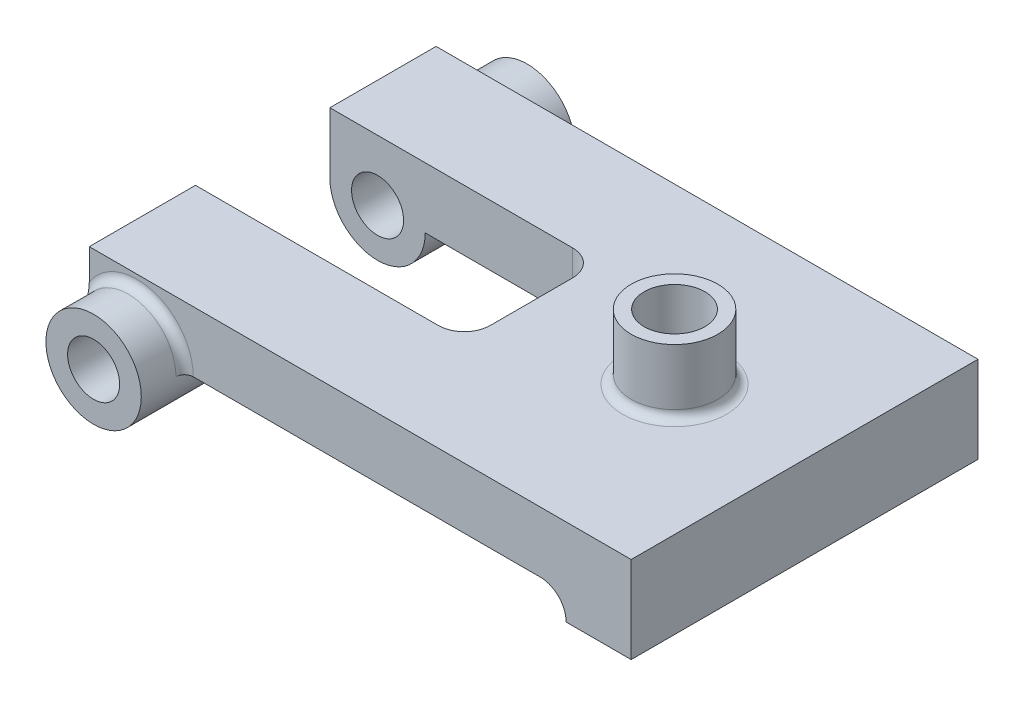
ISO-10303-21;
HEADER;
FILE_DESCRIPTION(('STEP AP214'),'2;1');
FILE_NAME('part.step','',(''),(''),'','','');
FILE_SCHEMA(('AUTOMOTIVE_DESIGN { 1 0 10303 214 1 1 1 1 }'));
ENDSEC;
DATA;
#1=APPLICATION_CONTEXT('core data for automotive mechanical design processes');
#2=APPLICATION_PROTOCOL_DEFINITION('international standard','automotive_design',2000,#1);
#3=PRODUCT_CONTEXT('',#1,'mechanical');
#4=PRODUCT('Part','Part','',(#3));
#5=PRODUCT_RELATED_PRODUCT_CATEGORY('part','',(#4));
#6=PRODUCT_DEFINITION_FORMATION('','',#4);
#7=PRODUCT_DEFINITION_CONTEXT('part definition',#1,'design');
#8=PRODUCT_DEFINITION('design','',#6,#7);
#9=PRODUCT_DEFINITION_SHAPE('','',#8);
#10=(LENGTH_UNIT() NAMED_UNIT(*) SI_UNIT(.MILLI.,.METRE.));
#11=(NAMED_UNIT(*) PLANE_ANGLE_UNIT() SI_UNIT($,.RADIAN.));
#12=(NAMED_UNIT(*) SI_UNIT($,.STERADIAN.) SOLID_ANGLE_UNIT());
#13=UNCERTAINTY_MEASURE_WITH_UNIT(LENGTH_MEASURE(1.E-05),#10,'distance_accuracy_value','');
#14=(GEOMETRIC_REPRESENTATION_CONTEXT(3) GLOBAL_UNCERTAINTY_ASSIGNED_CONTEXT((#13)) GLOBAL_UNIT_ASSIGNED_CONTEXT((#10,
#11,#12)) REPRESENTATION_CONTEXT('',''));
#15=CARTESIAN_POINT('',(0.,0.,0.));
#16=DIRECTION('',(0.,0.,1.));
#17=DIRECTION('',(1.,0.,0.));
#18=AXIS2_PLACEMENT_3D('',#15,#16,#17);
#19=CARTESIAN_POINT('',(0.,0.,40.));
#20=DIRECTION('',(-1.,0.,0.));
#21=DIRECTION('',(0.,-1.,0.));
#22=AXIS2_PLACEMENT_3D('',#19,#20,#21);
#23=PLANE('',#22);
#24=DIRECTION('',(0.,-1.,0.));
#25=VECTOR('',#24,1.);
#26=CARTESIAN_POINT('',(0.,20.,-15.5));
#27=LINE('',#26,#25);
#28=CARTESIAN_POINT('',(0.,20.,-15.5));
#29=VERTEX_POINT('',#28);
#30=CARTESIAN_POINT('',(0.,5.99631601618133,-15.5));
#31=VERTEX_POINT('',#30);
#32=EDGE_CURVE('E177',#29,#31,#27,.T.);
#33=ORIENTED_EDGE('',*,*,#32,.F.);
#34=DIRECTION('',(0.,0.,-1.));
#35=VECTOR('',#34,1.);
#36=CARTESIAN_POINT('',(0.,20.,40.));
#37=LINE('',#36,#35);
#38=CARTESIAN_POINT('',(0.,20.,-40.));
#39=VERTEX_POINT('',#38);
#40=EDGE_CURVE('E185',#29,#39,#37,.T.);
#41=ORIENTED_EDGE('',*,*,#40,.T.);
#42=DIRECTION('',(0.,1.,0.));
#43=VECTOR('',#42,1.);
#44=CARTESIAN_POINT('',(0.,0.,-40.));
#45=LINE('',#44,#43);
#46=CARTESIAN_POINT('',(0.,12.9245192464568,-40.));
#47=VERTEX_POINT('',#46);
#48=EDGE_CURVE('E292',#47,#39,#45,.T.);
#49=ORIENTED_EDGE('',*,*,#48,.F.);
#50=CARTESIAN_POINT('',(0.,12.9245192464568,-40.));
#51=CARTESIAN_POINT('',(0.,12.7926347995667,-40.0000195877206));
#52=CARTESIAN_POINT('',(0.,12.6607933304358,-40.0037039568171));
#53=CARTESIAN_POINT('',(0.,12.3975293760266,-40.0176384033789));
#54=CARTESIAN_POINT('',(0.,12.2661066899312,-40.0278846179913));
#55=CARTESIAN_POINT('',(0.,12.0042236462331,-40.0541440086299));
#56=CARTESIAN_POINT('',(0.,11.8737616263682,-40.0701410055855));
#57=CARTESIAN_POINT('',(0.,11.6135595427475,-40.1072767015453));
#58=CARTESIAN_POINT('',(0.,11.4838195999379,-40.1284162368858));
#59=CARTESIAN_POINT('',(0.,11.0985397145106,-40.1981930126899));
#60=CARTESIAN_POINT('',(0.,10.844195922614,-40.2534888297203));
#61=CARTESIAN_POINT('',(0.,10.3388851084676,-40.3782545428354));
#62=CARTESIAN_POINT('',(0.,10.0879210267826,-40.4477360266855));
#63=CARTESIAN_POINT('',(0.,9.51210822230671,-40.6210301613931));
#64=CARTESIAN_POINT('',(0.,9.18846281205875,-40.7288093836495));
#65=CARTESIAN_POINT('',(0.,8.54588775016297,-40.9576910405927));
#66=CARTESIAN_POINT('',(0.,8.22695977251006,-41.0787980818546));
#67=CARTESIAN_POINT('',(0.,7.27375991743096,-41.4553689198549));
#68=CARTESIAN_POINT('',(0.,6.64460404261237,-41.7235697880645));
#69=CARTESIAN_POINT('',(0.,6.00917952405726,-41.9945149951131));
#70=CARTESIAN_POINT('',(0.,6.00274776514438,-41.9972575065247));
#71=CARTESIAN_POINT('',(0.,5.99631601618133,-42.));
#72=B_SPLINE_CURVE_WITH_KNOTS('',3,(#50,#51,#52,#53,#54,#55,#56,#57,#58,#59,#60,#61,#62,#63,#64,
#65,#66,#67,#68,#69,#70,#71),.UNSPECIFIED.,.F.,.F.,(4,2,2,2,2,2,2,2,2,2,4),(0.,
0.395540642762623,0.790848650888231,1.18505310551169,1.57932171293576,2.35959856433424,
3.14051536472971,4.1634198417919,5.18667898860569,7.23803512077282,7.25901129773622),.UNSPECIFIED.);
#73=CARTESIAN_POINT('',(0.,5.99631601618133,-42.));
#74=VERTEX_POINT('',#73);
#75=EDGE_CURVE('E222',#47,#74,#72,.T.);
#76=ORIENTED_EDGE('',*,*,#75,.T.);
#77=DIRECTION('',(0.,0.,-1.));
#78=VECTOR('',#77,1.);
#79=CARTESIAN_POINT('',(0.,5.99631601618133,40.));
#80=LINE('',#79,#78);
#81=EDGE_CURVE('E285',#31,#74,#80,.T.);
#82=ORIENTED_EDGE('',*,*,#81,.F.);
#83=EDGE_LOOP('',(#33,#41,#49,#76,#82));
#84=FACE_BOUND('',#83,.T.);
#85=ADVANCED_FACE('F41',(#84),#23,.T.);
#86=CARTESIAN_POINT('',(0.,20.,40.));
#87=DIRECTION('',(0.,1.,0.));
#88=DIRECTION('',(0.,0.,1.));
#89=AXIS2_PLACEMENT_3D('',#86,#87,#88);
#90=PLANE('',#89);
#91=CARTESIAN_POINT('',(94.9999999999999,20.,0.));
#92=DIRECTION('',(0.,1.,0.));
#93=DIRECTION('',(0.,0.,1.));
#94=AXIS2_PLACEMENT_3D('',#91,#92,#93);
#95=CIRCLE('',#94,12.);
#96=CARTESIAN_POINT('',(94.9999999999999,20.,12.));
#97=VERTEX_POINT('',#96);
#98=EDGE_CURVE('E210',#97,#97,#95,.F.);
#99=ORIENTED_EDGE('',*,*,#98,.T.);
#100=EDGE_LOOP('',(#99));
#101=FACE_BOUND('',#100,.T.);
#102=DIRECTION('',(0.,0.,-1.));
#103=VECTOR('',#102,1.);
#104=CARTESIAN_POINT('',(62.,20.,-15.5));
#105=LINE('',#104,#103);
#106=CARTESIAN_POINT('',(62.,20.,9.5));
#107=VERTEX_POINT('',#106);
#108=CARTESIAN_POINT('',(62.,20.,-9.5));
#109=VERTEX_POINT('',#108);
#110=EDGE_CURVE('E167',#107,#109,#105,.T.);
#111=ORIENTED_EDGE('',*,*,#110,.F.);
#112=CARTESIAN_POINT('',(56.,20.,9.5));
#113=DIRECTION('',(0.,1.,0.));
#114=DIRECTION('',(0.,0.,1.));
#115=AXIS2_PLACEMENT_3D('',#112,#113,#114);
#116=CIRCLE('',#115,6.);
#117=CARTESIAN_POINT('',(56.,20.,15.5));
#118=VERTEX_POINT('',#117);
#119=EDGE_CURVE('E165',#107,#118,#116,.F.);
#120=ORIENTED_EDGE('',*,*,#119,.T.);
#121=DIRECTION('',(-1.,0.,0.));
#122=VECTOR('',#121,1.);
#123=CARTESIAN_POINT('',(62.,20.,15.5));
#124=LINE('',#123,#122);
#125=CARTESIAN_POINT('',(0.,20.,15.5));
#126=VERTEX_POINT('',#125);
#127=EDGE_CURVE('E152',#118,#126,#124,.T.);
#128=ORIENTED_EDGE('',*,*,#127,.T.);
#129=CARTESIAN_POINT('',(0.,20.,40.));
#130=VERTEX_POINT('',#129);
#131=EDGE_CURVE('E159',#130,#126,#37,.T.);
#132=ORIENTED_EDGE('',*,*,#131,.F.);
#133=DIRECTION('',(1.,0.,0.));
#134=VECTOR('',#133,1.);
#135=CARTESIAN_POINT('',(0.,20.,40.));
#136=LINE('',#135,#134);
#137=CARTESIAN_POINT('',(125.,20.,40.));
#138=VERTEX_POINT('',#137);
#139=EDGE_CURVE('E303',#130,#138,#136,.T.);
#140=ORIENTED_EDGE('',*,*,#139,.T.);
#141=DIRECTION('',(0.,0.,-1.));
#142=VECTOR('',#141,1.);
#143=CARTESIAN_POINT('',(125.,20.,40.));
#144=LINE('',#143,#142);
#145=CARTESIAN_POINT('',(125.,20.,-40.));
#146=VERTEX_POINT('',#145);
#147=EDGE_CURVE('E182',#138,#146,#144,.T.);
#148=ORIENTED_EDGE('',*,*,#147,.T.);
#149=DIRECTION('',(1.,0.,0.));
#150=VECTOR('',#149,1.);
#151=CARTESIAN_POINT('',(0.,20.,-40.));
#152=LINE('',#151,#150);
#153=EDGE_CURVE('E289',#39,#146,#152,.T.);
#154=ORIENTED_EDGE('',*,*,#153,.F.);
#155=ORIENTED_EDGE('',*,*,#40,.F.);
#156=DIRECTION('',(-1.,0.,0.));
#157=VECTOR('',#156,1.);
#158=CARTESIAN_POINT('',(62.,20.,-15.5));
#159=LINE('',#158,#157);
#160=CARTESIAN_POINT('',(56.,20.,-15.5));
#161=VERTEX_POINT('',#160);
#162=EDGE_CURVE('E164',#161,#29,#159,.T.);
#163=ORIENTED_EDGE('',*,*,#162,.F.);
#164=CARTESIAN_POINT('',(56.,20.,-9.5));
#165=DIRECTION('',(0.,1.,0.));
#166=DIRECTION('',(0.,0.,1.));
#167=AXIS2_PLACEMENT_3D('',#164,#165,#166);
#168=CIRCLE('',#167,6.);
#169=EDGE_CURVE('E11',#161,#109,#168,.F.);
#170=ORIENTED_EDGE('',*,*,#169,.T.);
#171=EDGE_LOOP('',(#111,#120,#128,#132,#140,#148,#154,#155,#163,#170));
#172=FACE_BOUND('',#171,.T.);
#173=ADVANCED_FACE('F160',(#101,#172),#90,.T.);
#174=CARTESIAN_POINT('',(11.,5.99631601618133,50.));
#175=DIRECTION('',(0.,0.,-1.));
#176=DIRECTION('',(-1.,0.,0.));
#177=AXIS2_PLACEMENT_3D('',#174,#175,#176);
#178=CYLINDRICAL_SURFACE('',#177,11.);
#179=CARTESIAN_POINT('',(11.,5.99631601618133,-50.));
#180=DIRECTION('',(0.,0.,1.));
#181=DIRECTION('',(1.,0.,0.));
#182=AXIS2_PLACEMENT_3D('',#179,#180,#181);
#183=CIRCLE('',#182,11.);
#184=CARTESIAN_POINT('',(22.,5.99631601618133,-50.));
#185=VERTEX_POINT('',#184);
#186=EDGE_CURVE('E355',#185,#185,#183,.T.);
#187=ORIENTED_EDGE('',*,*,#186,.T.);
#188=EDGE_LOOP('',(#187));
#189=FACE_BOUND('',#188,.T.);
#190=ORIENTED_EDGE('',*,*,#81,.T.);
#191=CARTESIAN_POINT('',(11.,5.99631601618133,-42.));
#192=DIRECTION('',(0.,0.,1.));
#193=DIRECTION('',(1.,0.,0.));
#194=AXIS2_PLACEMENT_3D('',#191,#192,#193);
#195=CIRCLE('',#194,11.);
#196=CARTESIAN_POINT('',(22.,5.99631601618133,-42.));
#197=VERTEX_POINT('',#196);
#198=EDGE_CURVE('E213',#74,#197,#195,.F.);
#199=ORIENTED_EDGE('',*,*,#198,.T.);
#200=DIRECTION('',(0.,0.,-1.));
#201=VECTOR('',#200,1.);
#202=CARTESIAN_POINT('',(22.,5.99631601618133,40.));
#203=LINE('',#202,#201);
#204=CARTESIAN_POINT('',(22.,5.99631601618133,-15.5));
#205=VERTEX_POINT('',#204);
#206=EDGE_CURVE('E302',#205,#197,#203,.T.);
#207=ORIENTED_EDGE('',*,*,#206,.F.);
#208=CARTESIAN_POINT('',(11.,5.99631601618133,-15.5));
#209=DIRECTION('',(0.,0.,-1.));
#210=DIRECTION('',(0.,1.,0.));
#211=AXIS2_PLACEMENT_3D('',#208,#209,#210);
#212=CIRCLE('',#211,11.);
#213=EDGE_CURVE('E201',#205,#31,#212,.T.);
#214=ORIENTED_EDGE('',*,*,#213,.T.);
#215=EDGE_LOOP('',(#190,#199,#207,#214));
#216=FACE_BOUND('',#215,.T.);
#217=ADVANCED_FACE('F273',(#189,#216),#178,.T.);
#218=CARTESIAN_POINT('',(11.,5.99631601618133,50.));
#219=DIRECTION('',(0.,0.,-1.));
#220=DIRECTION('',(-1.,0.,0.));
#221=AXIS2_PLACEMENT_3D('',#218,#219,#220);
#222=CYLINDRICAL_SURFACE('',#221,6.);
#223=CARTESIAN_POINT('',(11.,5.99631601618133,-15.5));
#224=DIRECTION('',(0.,0.,-1.));
#225=DIRECTION('',(0.,1.,0.));
#226=AXIS2_PLACEMENT_3D('',#223,#224,#225);
#227=CIRCLE('',#226,6.);
#228=CARTESIAN_POINT('',(11.,11.9963160161813,-15.5));
#229=VERTEX_POINT('',#228);
#230=EDGE_CURVE('E199',#229,#229,#227,.T.);
#231=ORIENTED_EDGE('',*,*,#230,.F.);
#232=EDGE_LOOP('',(#231));
#233=FACE_BOUND('',#232,.T.);
#234=CARTESIAN_POINT('',(11.,5.99631601618133,-50.));
#235=DIRECTION('',(0.,0.,1.));
#236=DIRECTION('',(1.,0.,0.));
#237=AXIS2_PLACEMENT_3D('',#234,#235,#236);
#238=CIRCLE('',#237,6.);
#239=CARTESIAN_POINT('',(17.,5.99631601618133,-50.));
#240=VERTEX_POINT('',#239);
#241=EDGE_CURVE('E346',#240,#240,#238,.T.);
#242=ORIENTED_EDGE('',*,*,#241,.F.);
#243=EDGE_LOOP('',(#242));
#244=FACE_BOUND('',#243,.T.);
#245=ADVANCED_FACE('F404',(#233,#244),#222,.F.);
#246=CARTESIAN_POINT('',(0.,5.99631601618133,40.));
#247=DIRECTION('',(0.,-1.,0.));
#248=DIRECTION('',(0.,0.,-1.));
#249=AXIS2_PLACEMENT_3D('',#246,#247,#248);
#250=PLANE('',#249);
#251=CARTESIAN_POINT('',(94.9999999999999,5.99631601618133,0.));
#252=DIRECTION('',(0.,-1.,0.));
#253=DIRECTION('',(0.,0.,-1.));
#254=AXIS2_PLACEMENT_3D('',#251,#252,#253);
#255=CIRCLE('',#254,7.);
#256=CARTESIAN_POINT('',(94.9999999999999,5.99631601618133,-7.));
#257=VERTEX_POINT('',#256);
#258=EDGE_CURVE('E44',#257,#257,#255,.T.);
#259=ORIENTED_EDGE('',*,*,#258,.F.);
#260=EDGE_LOOP('',(#259));
#261=FACE_BOUND('',#260,.T.);
#262=DIRECTION('',(1.,0.,0.));
#263=VECTOR('',#262,1.);
#264=CARTESIAN_POINT('',(0.,5.99631601618133,-15.5));
#265=LINE('',#264,#263);
#266=CARTESIAN_POINT('',(56.,5.99631601618133,-15.5));
#267=VERTEX_POINT('',#266);
#268=EDGE_CURVE('E339',#205,#267,#265,.T.);
#269=ORIENTED_EDGE('',*,*,#268,.F.);
#270=ORIENTED_EDGE('',*,*,#206,.T.);
#271=CARTESIAN_POINT('',(24.,5.99631601618133,-42.));
#272=DIRECTION('',(0.,-1.,0.));
#273=DIRECTION('',(0.,0.,-1.));
#274=AXIS2_PLACEMENT_3D('',#271,#272,#273);
#275=CIRCLE('',#274,2.);
#276=CARTESIAN_POINT('',(24.,5.99631601618133,-40.));
#277=VERTEX_POINT('',#276);
#278=EDGE_CURVE('E229',#197,#277,#275,.F.);
#279=ORIENTED_EDGE('',*,*,#278,.T.);
#280=DIRECTION('',(-1.,0.,0.));
#281=VECTOR('',#280,1.);
#282=CARTESIAN_POINT('',(0.,5.99631601618133,-40.));
#283=LINE('',#282,#281);
#284=CARTESIAN_POINT('',(103.789775752856,5.99631601618133,-40.));
#285=VERTEX_POINT('',#284);
#286=EDGE_CURVE('E313',#285,#277,#283,.T.);
#287=ORIENTED_EDGE('',*,*,#286,.F.);
#288=DIRECTION('',(0.,0.,-1.));
#289=VECTOR('',#288,1.);
#290=CARTESIAN_POINT('',(103.789775752856,5.99631601618133,40.));
#291=LINE('',#290,#289);
#292=CARTESIAN_POINT('',(103.789775752856,5.99631601618133,40.));
#293=VERTEX_POINT('',#292);
#294=EDGE_CURVE('E191',#293,#285,#291,.T.);
#295=ORIENTED_EDGE('',*,*,#294,.F.);
#296=DIRECTION('',(-1.,0.,0.));
#297=VECTOR('',#296,1.);
#298=CARTESIAN_POINT('',(0.,5.99631601618133,40.));
#299=LINE('',#298,#297);
#300=CARTESIAN_POINT('',(24.,5.99631601618133,40.));
#301=VERTEX_POINT('',#300);
#302=EDGE_CURVE('E294',#293,#301,#299,.T.);
#303=ORIENTED_EDGE('',*,*,#302,.T.);
#304=CARTESIAN_POINT('',(24.,5.99631601618133,42.));
#305=DIRECTION('',(0.,-1.,0.));
#306=DIRECTION('',(0.,0.,-1.));
#307=AXIS2_PLACEMENT_3D('',#304,#305,#306);
#308=CIRCLE('',#307,2.);
#309=CARTESIAN_POINT('',(22.,5.99631601618133,42.));
#310=VERTEX_POINT('',#309);
#311=EDGE_CURVE('E252',#301,#310,#308,.F.);
#312=ORIENTED_EDGE('',*,*,#311,.T.);
#313=CARTESIAN_POINT('',(22.,5.99631601618133,15.5));
#314=VERTEX_POINT('',#313);
#315=EDGE_CURVE('E297',#310,#314,#203,.T.);
#316=ORIENTED_EDGE('',*,*,#315,.T.);
#317=DIRECTION('',(-1.,0.,0.));
#318=VECTOR('',#317,1.);
#319=CARTESIAN_POINT('',(0.,5.99631601618133,15.5));
#320=LINE('',#319,#318);
#321=CARTESIAN_POINT('',(56.,5.99631601618133,15.5));
#322=VERTEX_POINT('',#321);
#323=EDGE_CURVE('E204',#322,#314,#320,.T.);
#324=ORIENTED_EDGE('',*,*,#323,.F.);
#325=CARTESIAN_POINT('',(56.,5.99631601618133,9.5));
#326=DIRECTION('',(0.,-1.,0.));
#327=DIRECTION('',(0.,0.,-1.));
#328=AXIS2_PLACEMENT_3D('',#325,#326,#327);
#329=CIRCLE('',#328,6.);
#330=CARTESIAN_POINT('',(62.,5.99631601618133,9.5));
#331=VERTEX_POINT('',#330);
#332=EDGE_CURVE('E385',#322,#331,#329,.F.);
#333=ORIENTED_EDGE('',*,*,#332,.T.);
#334=DIRECTION('',(0.,0.,-1.));
#335=VECTOR('',#334,1.);
#336=CARTESIAN_POINT('',(62.,5.99631601618133,40.));
#337=LINE('',#336,#335);
#338=CARTESIAN_POINT('',(62.,5.99631601618133,-9.5));
#339=VERTEX_POINT('',#338);
#340=EDGE_CURVE('E344',#331,#339,#337,.T.);
#341=ORIENTED_EDGE('',*,*,#340,.T.);
#342=CARTESIAN_POINT('',(56.,5.99631601618133,-9.5));
#343=DIRECTION('',(0.,-1.,0.));
#344=DIRECTION('',(0.,0.,-1.));
#345=AXIS2_PLACEMENT_3D('',#342,#343,#344);
#346=CIRCLE('',#345,6.);
#347=EDGE_CURVE('E49',#339,#267,#346,.F.);
#348=ORIENTED_EDGE('',*,*,#347,.T.);
#349=EDGE_LOOP('',(#269,#270,#279,#287,#295,#303,#312,#316,#324,#333,#341,#348));
#350=FACE_BOUND('',#349,.T.);
#351=ADVANCED_FACE('F334',(#261,#350),#250,.T.);
#352=CARTESIAN_POINT('',(104.,0.,40.));
#353=DIRECTION('',(0.,0.,-1.));
#354=DIRECTION('',(-1.,0.,0.));
#355=AXIS2_PLACEMENT_3D('',#352,#353,#354);
#356=CYLINDRICAL_SURFACE('',#355,6.);
#357=CARTESIAN_POINT('',(104.,0.,-40.));
#358=DIRECTION('',(0.,0.,1.));
#359=DIRECTION('',(1.,0.,0.));
#360=AXIS2_PLACEMENT_3D('',#357,#358,#359);
#361=CIRCLE('',#360,6.);
#362=CARTESIAN_POINT('',(110.,0.,-40.));
#363=VERTEX_POINT('',#362);
#364=EDGE_CURVE('E314',#285,#363,#361,.F.);
#365=ORIENTED_EDGE('',*,*,#364,.T.);
#366=DIRECTION('',(0.,0.,-1.));
#367=VECTOR('',#366,1.);
#368=CARTESIAN_POINT('',(110.,0.,40.));
#369=LINE('',#368,#367);
#370=CARTESIAN_POINT('',(110.,0.,40.));
#371=VERTEX_POINT('',#370);
#372=EDGE_CURVE('E194',#371,#363,#369,.T.);
#373=ORIENTED_EDGE('',*,*,#372,.F.);
#374=CARTESIAN_POINT('',(104.,0.,40.));
#375=DIRECTION('',(0.,0.,1.));
#376=DIRECTION('',(1.,0.,0.));
#377=AXIS2_PLACEMENT_3D('',#374,#375,#376);
#378=CIRCLE('',#377,6.);
#379=EDGE_CURVE('E329',#293,#371,#378,.F.);
#380=ORIENTED_EDGE('',*,*,#379,.F.);
#381=ORIENTED_EDGE('',*,*,#294,.T.);
#382=EDGE_LOOP('',(#365,#373,#380,#381));
#383=FACE_BOUND('',#382,.T.);
#384=ADVANCED_FACE('F328',(#383),#356,.F.);
#385=CARTESIAN_POINT('',(0.,0.,40.));
#386=DIRECTION('',(0.,-1.,0.));
#387=DIRECTION('',(1.,0.,0.));
#388=AXIS2_PLACEMENT_3D('',#385,#386,#387);
#389=PLANE('',#388);
#390=DIRECTION('',(-1.,0.,0.));
#391=VECTOR('',#390,1.);
#392=CARTESIAN_POINT('',(0.,0.,-40.));
#393=LINE('',#392,#391);
#394=CARTESIAN_POINT('',(125.,0.,-40.));
#395=VERTEX_POINT('',#394);
#396=EDGE_CURVE('E298',#395,#363,#393,.T.);
#397=ORIENTED_EDGE('',*,*,#396,.F.);
#398=DIRECTION('',(0.,0.,-1.));
#399=VECTOR('',#398,1.);
#400=CARTESIAN_POINT('',(125.,0.,40.));
#401=LINE('',#400,#399);
#402=CARTESIAN_POINT('',(125.,0.,40.));
#403=VERTEX_POINT('',#402);
#404=EDGE_CURVE('E184',#403,#395,#401,.T.);
#405=ORIENTED_EDGE('',*,*,#404,.F.);
#406=DIRECTION('',(-1.,0.,0.));
#407=VECTOR('',#406,1.);
#408=CARTESIAN_POINT('',(0.,0.,40.));
#409=LINE('',#408,#407);
#410=EDGE_CURVE('E326',#403,#371,#409,.T.);
#411=ORIENTED_EDGE('',*,*,#410,.T.);
#412=ORIENTED_EDGE('',*,*,#372,.T.);
#413=EDGE_LOOP('',(#397,#405,#411,#412));
#414=FACE_BOUND('',#413,.T.);
#415=ADVANCED_FACE('F325',(#414),#389,.T.);
#416=CARTESIAN_POINT('',(125.,2.60208521396521E-13,40.));
#417=DIRECTION('',(1.,0.,0.));
#418=DIRECTION('',(0.,1.,0.));
#419=AXIS2_PLACEMENT_3D('',#416,#417,#418);
#420=PLANE('',#419);
#421=DIRECTION('',(0.,-1.,0.));
#422=VECTOR('',#421,1.);
#423=CARTESIAN_POINT('',(125.,2.60208521396521E-13,-40.));
#424=LINE('',#423,#422);
#425=EDGE_CURVE('E295',#146,#395,#424,.T.);
#426=ORIENTED_EDGE('',*,*,#425,.F.);
#427=ORIENTED_EDGE('',*,*,#147,.F.);
#428=DIRECTION('',(0.,-1.,0.));
#429=VECTOR('',#428,1.);
#430=CARTESIAN_POINT('',(125.,2.60208521396521E-13,40.));
#431=LINE('',#430,#429);
#432=EDGE_CURVE('E307',#138,#403,#431,.T.);
#433=ORIENTED_EDGE('',*,*,#432,.T.);
#434=ORIENTED_EDGE('',*,*,#404,.T.);
#435=EDGE_LOOP('',(#426,#427,#433,#434));
#436=FACE_BOUND('',#435,.T.);
#437=ADVANCED_FACE('F243',(#436),#420,.T.);
#438=DIRECTION('',(0.,1.,0.));
#439=VECTOR('',#438,1.);
#440=CARTESIAN_POINT('',(0.,20.,15.5));
#441=LINE('',#440,#439);
#442=CARTESIAN_POINT('',(0.,5.99631601618133,15.5));
#443=VERTEX_POINT('',#442);
#444=EDGE_CURVE('E166',#443,#126,#441,.T.);
#445=ORIENTED_EDGE('',*,*,#444,.F.);
#446=CARTESIAN_POINT('',(0.,5.99631601618133,42.));
#447=VERTEX_POINT('',#446);
#448=EDGE_CURVE('E190',#447,#443,#80,.T.);
#449=ORIENTED_EDGE('',*,*,#448,.F.);
#450=CARTESIAN_POINT('',(0.,12.9245192464568,40.));
#451=CARTESIAN_POINT('',(0.,12.7926347995667,40.0000195877206));
#452=CARTESIAN_POINT('',(0.,12.6607933304358,40.0037039568171));
#453=CARTESIAN_POINT('',(0.,12.3975293760266,40.0176384033789));
#454=CARTESIAN_POINT('',(0.,12.2661066899312,40.0278846179913));
#455=CARTESIAN_POINT('',(0.,12.0042236462331,40.0541440086299));
#456=CARTESIAN_POINT('',(0.,11.8737616263682,40.0701410055856));
#457=CARTESIAN_POINT('',(0.,11.6135595427475,40.1072767015453));
#458=CARTESIAN_POINT('',(0.,11.4838195999379,40.1284162368858));
#459=CARTESIAN_POINT('',(0.,11.0985397145106,40.1981930126899));
#460=CARTESIAN_POINT('',(0.,10.8441959226141,40.2534888297203));
#461=CARTESIAN_POINT('',(0.,10.3388851084676,40.3782545428354));
#462=CARTESIAN_POINT('',(0.,10.0879210267826,40.4477360266855));
#463=CARTESIAN_POINT('',(0.,9.51210822230671,40.6210301613931));
#464=CARTESIAN_POINT('',(0.,9.18846281205875,40.7288093836496));
#465=CARTESIAN_POINT('',(0.,8.54588775016297,40.9576910405927));
#466=CARTESIAN_POINT('',(0.,8.22695977251006,41.0787980818546));
#467=CARTESIAN_POINT('',(0.,7.27375991743096,41.455368919855));
#468=CARTESIAN_POINT('',(0.,6.64460404261237,41.7235697880645));
#469=CARTESIAN_POINT('',(0.,6.00917952405726,41.9945149951131));
#470=CARTESIAN_POINT('',(0.,6.00274776514438,41.9972575065247));
#471=CARTESIAN_POINT('',(0.,5.99631601618133,42.));
#472=B_SPLINE_CURVE_WITH_KNOTS('',3,(#450,#451,#452,#453,#454,#455,#456,#457,#458,#459,#460,
#461,#462,#463,#464,#465,#466,#467,#468,#469,#470,#471),.UNSPECIFIED.,.F.,.F.,(4,2,2,2,2,2,2,2,
2,2,4),(0.,0.395540642762622,0.790848650888227,1.18505310551169,1.57932171293576,
2.35959856433424,3.14051536472971,4.1634198417919,5.18667898860569,7.23803512077282,
7.25901129773622),.UNSPECIFIED.);
#473=CARTESIAN_POINT('',(0.,12.9245192464568,40.));
#474=VERTEX_POINT('',#473);
#475=EDGE_CURVE('E247',#447,#474,#472,.F.);
#476=ORIENTED_EDGE('',*,*,#475,.T.);
#477=DIRECTION('',(0.,1.,0.));
#478=VECTOR('',#477,1.);
#479=CARTESIAN_POINT('',(0.,0.,40.));
#480=LINE('',#479,#478);
#481=EDGE_CURVE('E178',#474,#130,#480,.T.);
#482=ORIENTED_EDGE('',*,*,#481,.T.);
#483=ORIENTED_EDGE('',*,*,#131,.T.);
#484=EDGE_LOOP('',(#445,#449,#476,#482,#483));
#485=FACE_BOUND('',#484,.T.);
#486=ADVANCED_FACE('F180',(#485),#23,.T.);
#487=CARTESIAN_POINT('',(0.,0.,40.));
#488=DIRECTION('',(0.,0.,1.));
#489=DIRECTION('',(1.,0.,0.));
#490=AXIS2_PLACEMENT_3D('',#487,#488,#489);
#491=PLANE('',#490);
#492=ORIENTED_EDGE('',*,*,#481,.F.);
#493=CARTESIAN_POINT('',(11.,5.99631601618133,40.));
#494=DIRECTION('',(0.,0.,1.));
#495=DIRECTION('',(1.,0.,0.));
#496=AXIS2_PLACEMENT_3D('',#493,#494,#495);
#497=CIRCLE('',#496,13.);
#498=EDGE_CURVE('E218',#474,#301,#497,.F.);
#499=ORIENTED_EDGE('',*,*,#498,.T.);
#500=ORIENTED_EDGE('',*,*,#302,.F.);
#501=ORIENTED_EDGE('',*,*,#379,.T.);
#502=ORIENTED_EDGE('',*,*,#410,.F.);
#503=ORIENTED_EDGE('',*,*,#432,.F.);
#504=ORIENTED_EDGE('',*,*,#139,.F.);
#505=EDGE_LOOP('',(#492,#499,#500,#501,#502,#503,#504));
#506=FACE_BOUND('',#505,.T.);
#507=ADVANCED_FACE('F238',(#506),#491,.T.);
#508=CARTESIAN_POINT('',(0.,0.,-40.));
#509=DIRECTION('',(0.,0.,1.));
#510=DIRECTION('',(1.,0.,0.));
#511=AXIS2_PLACEMENT_3D('',#508,#509,#510);
#512=PLANE('',#511);
#513=ORIENTED_EDGE('',*,*,#286,.T.);
#514=CARTESIAN_POINT('',(11.,5.99631601618133,-40.));
#515=DIRECTION('',(0.,0.,1.));
#516=DIRECTION('',(1.,0.,0.));
#517=AXIS2_PLACEMENT_3D('',#514,#515,#516);
#518=CIRCLE('',#517,13.);
#519=EDGE_CURVE('E209',#277,#47,#518,.T.);
#520=ORIENTED_EDGE('',*,*,#519,.T.);
#521=ORIENTED_EDGE('',*,*,#48,.T.);
#522=ORIENTED_EDGE('',*,*,#153,.T.);
#523=ORIENTED_EDGE('',*,*,#425,.T.);
#524=ORIENTED_EDGE('',*,*,#396,.T.);
#525=ORIENTED_EDGE('',*,*,#364,.F.);
#526=EDGE_LOOP('',(#513,#520,#521,#522,#523,#524,#525));
#527=FACE_BOUND('',#526,.T.);
#528=ADVANCED_FACE('F245',(#527),#512,.F.);
#529=CARTESIAN_POINT('',(11.,5.99631601618133,42.));
#530=DIRECTION('',(0.,0.,1.));
#531=DIRECTION('',(1.,0.,0.));
#532=AXIS2_PLACEMENT_3D('',#529,#530,#531);
#533=CIRCLE('',#532,11.);
#534=EDGE_CURVE('E216',#310,#447,#533,.T.);
#535=ORIENTED_EDGE('',*,*,#534,.T.);
#536=ORIENTED_EDGE('',*,*,#448,.T.);
#537=CARTESIAN_POINT('',(11.,5.99631601618133,15.5));
#538=DIRECTION('',(0.,0.,1.));
#539=DIRECTION('',(1.,0.,0.));
#540=AXIS2_PLACEMENT_3D('',#537,#538,#539);
#541=CIRCLE('',#540,11.);
#542=EDGE_CURVE('E171',#443,#314,#541,.T.);
#543=ORIENTED_EDGE('',*,*,#542,.T.);
#544=ORIENTED_EDGE('',*,*,#315,.F.);
#545=EDGE_LOOP('',(#535,#536,#543,#544));
#546=FACE_BOUND('',#545,.T.);
#547=CARTESIAN_POINT('',(11.,5.99631601618133,50.));
#548=DIRECTION('',(0.,0.,1.));
#549=DIRECTION('',(1.,0.,0.));
#550=AXIS2_PLACEMENT_3D('',#547,#548,#549);
#551=CIRCLE('',#550,11.);
#552=CARTESIAN_POINT('',(22.,5.99631601618133,50.));
#553=VERTEX_POINT('',#552);
#554=EDGE_CURVE('E312',#553,#553,#551,.T.);
#555=ORIENTED_EDGE('',*,*,#554,.F.);
#556=EDGE_LOOP('',(#555));
#557=FACE_BOUND('',#556,.T.);
#558=ADVANCED_FACE('F390',(#546,#557),#178,.T.);
#559=CARTESIAN_POINT('',(11.,5.99631601618133,15.5));
#560=DIRECTION('',(0.,0.,1.));
#561=DIRECTION('',(1.,0.,0.));
#562=AXIS2_PLACEMENT_3D('',#559,#560,#561);
#563=CIRCLE('',#562,6.);
#564=CARTESIAN_POINT('',(17.,5.99631601618133,15.5));
#565=VERTEX_POINT('',#564);
#566=EDGE_CURVE('E197',#565,#565,#563,.T.);
#567=ORIENTED_EDGE('',*,*,#566,.F.);
#568=EDGE_LOOP('',(#567));
#569=FACE_BOUND('',#568,.T.);
#570=CARTESIAN_POINT('',(11.,5.99631601618133,50.));
#571=DIRECTION('',(0.,0.,1.));
#572=DIRECTION('',(1.,0.,0.));
#573=AXIS2_PLACEMENT_3D('',#570,#571,#572);
#574=CIRCLE('',#573,6.);
#575=CARTESIAN_POINT('',(17.,5.99631601618133,50.));
#576=VERTEX_POINT('',#575);
#577=EDGE_CURVE('E349',#576,#576,#574,.T.);
#578=ORIENTED_EDGE('',*,*,#577,.T.);
#579=EDGE_LOOP('',(#578));
#580=FACE_BOUND('',#579,.T.);
#581=ADVANCED_FACE('F411',(#569,#580),#222,.F.);
#582=CARTESIAN_POINT('',(0.,0.,50.));
#583=DIRECTION('',(0.,0.,1.));
#584=DIRECTION('',(1.,0.,0.));
#585=AXIS2_PLACEMENT_3D('',#582,#583,#584);
#586=PLANE('',#585);
#587=ORIENTED_EDGE('',*,*,#577,.F.);
#588=EDGE_LOOP('',(#587));
#589=FACE_BOUND('',#588,.T.);
#590=ORIENTED_EDGE('',*,*,#554,.T.);
#591=EDGE_LOOP('',(#590));
#592=FACE_BOUND('',#591,.T.);
#593=ADVANCED_FACE('F450',(#589,#592),#586,.T.);
#594=CARTESIAN_POINT('',(0.,0.,-50.));
#595=DIRECTION('',(0.,0.,1.));
#596=DIRECTION('',(1.,0.,0.));
#597=AXIS2_PLACEMENT_3D('',#594,#595,#596);
#598=PLANE('',#597);
#599=ORIENTED_EDGE('',*,*,#241,.T.);
#600=EDGE_LOOP('',(#599));
#601=FACE_BOUND('',#600,.T.);
#602=ORIENTED_EDGE('',*,*,#186,.F.);
#603=EDGE_LOOP('',(#602));
#604=FACE_BOUND('',#603,.T.);
#605=ADVANCED_FACE('F448',(#601,#604),#598,.F.);
#606=CARTESIAN_POINT('',(62.,20.,-15.5));
#607=DIRECTION('',(0.,0.,-1.));
#608=DIRECTION('',(0.,1.,0.));
#609=AXIS2_PLACEMENT_3D('',#606,#607,#608);
#610=PLANE('',#609);
#611=ORIENTED_EDGE('',*,*,#268,.T.);
#612=DIRECTION('',(0.,-1.,0.));
#613=VECTOR('',#612,1.);
#614=CARTESIAN_POINT('',(56.,20.,-15.5));
#615=LINE('',#614,#613);
#616=EDGE_CURVE('E60',#267,#161,#615,.F.);
#617=ORIENTED_EDGE('',*,*,#616,.T.);
#618=ORIENTED_EDGE('',*,*,#162,.T.);
#619=ORIENTED_EDGE('',*,*,#32,.T.);
#620=ORIENTED_EDGE('',*,*,#213,.F.);
#621=EDGE_LOOP('',(#611,#617,#618,#619,#620));
#622=FACE_BOUND('',#621,.T.);
#623=ORIENTED_EDGE('',*,*,#230,.T.);
#624=EDGE_LOOP('',(#623));
#625=FACE_BOUND('',#624,.T.);
#626=ADVANCED_FACE('F444',(#622,#625),#610,.F.);
#627=CARTESIAN_POINT('',(62.,20.,15.5));
#628=DIRECTION('',(0.,0.,1.));
#629=DIRECTION('',(1.,0.,0.));
#630=AXIS2_PLACEMENT_3D('',#627,#628,#629);
#631=PLANE('',#630);
#632=ORIENTED_EDGE('',*,*,#127,.F.);
#633=DIRECTION('',(0.,1.,0.));
#634=VECTOR('',#633,1.);
#635=CARTESIAN_POINT('',(56.,20.,15.5));
#636=LINE('',#635,#634);
#637=EDGE_CURVE('E376',#118,#322,#636,.F.);
#638=ORIENTED_EDGE('',*,*,#637,.T.);
#639=ORIENTED_EDGE('',*,*,#323,.T.);
#640=ORIENTED_EDGE('',*,*,#542,.F.);
#641=ORIENTED_EDGE('',*,*,#444,.T.);
#642=EDGE_LOOP('',(#632,#638,#639,#640,#641));
#643=FACE_BOUND('',#642,.T.);
#644=ORIENTED_EDGE('',*,*,#566,.T.);
#645=EDGE_LOOP('',(#644));
#646=FACE_BOUND('',#645,.T.);
#647=ADVANCED_FACE('F168',(#643,#646),#631,.F.);
#648=CARTESIAN_POINT('',(62.,0.,0.));
#649=DIRECTION('',(-1.,0.,0.));
#650=DIRECTION('',(0.,-1.,0.));
#651=AXIS2_PLACEMENT_3D('',#648,#649,#650);
#652=PLANE('',#651);
#653=ORIENTED_EDGE('',*,*,#340,.F.);
#654=DIRECTION('',(0.,1.,0.));
#655=VECTOR('',#654,1.);
#656=CARTESIAN_POINT('',(62.,0.,9.5));
#657=LINE('',#656,#655);
#658=EDGE_CURVE('E367',#331,#107,#657,.T.);
#659=ORIENTED_EDGE('',*,*,#658,.T.);
#660=ORIENTED_EDGE('',*,*,#110,.T.);
#661=DIRECTION('',(0.,-1.,0.));
#662=VECTOR('',#661,1.);
#663=CARTESIAN_POINT('',(62.,0.,-9.5));
#664=LINE('',#663,#662);
#665=EDGE_CURVE('E366',#109,#339,#664,.T.);
#666=ORIENTED_EDGE('',*,*,#665,.T.);
#667=EDGE_LOOP('',(#653,#659,#660,#666));
#668=FACE_BOUND('',#667,.T.);
#669=ADVANCED_FACE('F384',(#668),#652,.T.);
#670=CARTESIAN_POINT('',(94.9999999999999,35.,0.));
#671=DIRECTION('',(0.,1.,0.));
#672=DIRECTION('',(0.,0.,1.));
#673=AXIS2_PLACEMENT_3D('',#670,#671,#672);
#674=PLANE('',#673);
#675=CARTESIAN_POINT('',(94.9999999999999,35.,0.));
#676=DIRECTION('',(0.,1.,0.));
#677=DIRECTION('',(0.,0.,1.));
#678=AXIS2_PLACEMENT_3D('',#675,#676,#677);
#679=CIRCLE('',#678,9.99999999999999);
#680=CARTESIAN_POINT('',(94.9999999999999,35.,9.99999999999999));
#681=VERTEX_POINT('',#680);
#682=EDGE_CURVE('E281',#681,#681,#679,.T.);
#683=ORIENTED_EDGE('',*,*,#682,.T.);
#684=EDGE_LOOP('',(#683));
#685=FACE_BOUND('',#684,.T.);
#686=CARTESIAN_POINT('',(94.9999999999999,35.,0.));
#687=DIRECTION('',(0.,1.,0.));
#688=DIRECTION('',(0.,0.,1.));
#689=AXIS2_PLACEMENT_3D('',#686,#687,#688);
#690=CIRCLE('',#689,7.);
#691=CARTESIAN_POINT('',(94.9999999999999,35.,7.));
#692=VERTEX_POINT('',#691);
#693=EDGE_CURVE('E392',#692,#692,#690,.T.);
#694=ORIENTED_EDGE('',*,*,#693,.F.);
#695=EDGE_LOOP('',(#694));
#696=FACE_BOUND('',#695,.T.);
#697=ADVANCED_FACE('F429',(#685,#696),#674,.T.);
#698=CARTESIAN_POINT('',(94.9999999999999,35.,0.));
#699=DIRECTION('',(0.,-1.,0.));
#700=DIRECTION('',(0.,0.,-1.));
#701=AXIS2_PLACEMENT_3D('',#698,#699,#700);
#702=CYLINDRICAL_SURFACE('',#701,9.99999999999999);
#703=CARTESIAN_POINT('',(94.9999999999999,22.,0.));
#704=DIRECTION('',(0.,1.,0.));
#705=DIRECTION('',(0.,0.,1.));
#706=AXIS2_PLACEMENT_3D('',#703,#704,#705);
#707=CIRCLE('',#706,9.99999999999999);
#708=CARTESIAN_POINT('',(94.9999999999999,22.,9.99999999999999));
#709=VERTEX_POINT('',#708);
#710=EDGE_CURVE('E198',#709,#709,#707,.T.);
#711=ORIENTED_EDGE('',*,*,#710,.T.);
#712=EDGE_LOOP('',(#711));
#713=FACE_BOUND('',#712,.T.);
#714=ORIENTED_EDGE('',*,*,#682,.F.);
#715=EDGE_LOOP('',(#714));
#716=FACE_BOUND('',#715,.T.);
#717=ADVANCED_FACE('F421',(#713,#716),#702,.T.);
#718=CARTESIAN_POINT('',(94.9999999999999,35.,0.));
#719=DIRECTION('',(0.,-1.,0.));
#720=DIRECTION('',(0.,0.,-1.));
#721=AXIS2_PLACEMENT_3D('',#718,#719,#720);
#722=CYLINDRICAL_SURFACE('',#721,7.);
#723=ORIENTED_EDGE('',*,*,#693,.T.);
#724=EDGE_LOOP('',(#723));
#725=FACE_BOUND('',#724,.T.);
#726=ORIENTED_EDGE('',*,*,#258,.T.);
#727=EDGE_LOOP('',(#726));
#728=FACE_BOUND('',#727,.T.);
#729=ADVANCED_FACE('F402',(#725,#728),#722,.F.);
#730=CARTESIAN_POINT('',(94.9999999999999,22.,0.));
#731=DIRECTION('',(0.,1.,0.));
#732=DIRECTION('',(0.,0.,1.));
#733=AXIS2_PLACEMENT_3D('',#730,#731,#732);
#734=TOROIDAL_SURFACE('',#733,12.,2.);
#735=ORIENTED_EDGE('',*,*,#98,.F.);
#736=EDGE_LOOP('',(#735));
#737=FACE_BOUND('',#736,.T.);
#738=ORIENTED_EDGE('',*,*,#710,.F.);
#739=EDGE_LOOP('',(#738));
#740=FACE_BOUND('',#739,.T.);
#741=ADVANCED_FACE('F418',(#737,#740),#734,.F.);
#742=CARTESIAN_POINT('',(11.,5.99631601618133,-42.));
#743=DIRECTION('',(0.,0.,1.));
#744=DIRECTION('',(1.,0.,0.));
#745=AXIS2_PLACEMENT_3D('',#742,#743,#744);
#746=TOROIDAL_SURFACE('',#745,13.,2.);
#747=ORIENTED_EDGE('',*,*,#278,.F.);
#748=ORIENTED_EDGE('',*,*,#198,.F.);
#749=ORIENTED_EDGE('',*,*,#75,.F.);
#750=ORIENTED_EDGE('',*,*,#519,.F.);
#751=EDGE_LOOP('',(#747,#748,#749,#750));
#752=FACE_BOUND('',#751,.T.);
#753=ADVANCED_FACE('F234',(#752),#746,.F.);
#754=CARTESIAN_POINT('',(11.,5.99631601618133,42.));
#755=DIRECTION('',(0.,0.,1.));
#756=DIRECTION('',(1.,0.,0.));
#757=AXIS2_PLACEMENT_3D('',#754,#755,#756);
#758=TOROIDAL_SURFACE('',#757,13.,2.);
#759=ORIENTED_EDGE('',*,*,#311,.F.);
#760=ORIENTED_EDGE('',*,*,#498,.F.);
#761=ORIENTED_EDGE('',*,*,#475,.F.);
#762=ORIENTED_EDGE('',*,*,#534,.F.);
#763=EDGE_LOOP('',(#759,#760,#761,#762));
#764=FACE_BOUND('',#763,.T.);
#765=ADVANCED_FACE('F255',(#764),#758,.F.);
#766=CARTESIAN_POINT('',(56.,0.,9.5));
#767=DIRECTION('',(0.,1.,0.));
#768=DIRECTION('',(-1.,0.,0.));
#769=AXIS2_PLACEMENT_3D('',#766,#767,#768);
#770=CYLINDRICAL_SURFACE('',#769,6.);
#771=ORIENTED_EDGE('',*,*,#332,.F.);
#772=ORIENTED_EDGE('',*,*,#637,.F.);
#773=ORIENTED_EDGE('',*,*,#119,.F.);
#774=ORIENTED_EDGE('',*,*,#658,.F.);
#775=EDGE_LOOP('',(#771,#772,#773,#774));
#776=FACE_BOUND('',#775,.T.);
#777=ADVANCED_FACE('F260',(#776),#770,.F.);
#778=CARTESIAN_POINT('',(56.,0.,-9.5));
#779=DIRECTION('',(0.,-1.,0.));
#780=DIRECTION('',(1.,0.,0.));
#781=AXIS2_PLACEMENT_3D('',#778,#779,#780);
#782=CYLINDRICAL_SURFACE('',#781,6.);
#783=ORIENTED_EDGE('',*,*,#169,.F.);
#784=ORIENTED_EDGE('',*,*,#616,.F.);
#785=ORIENTED_EDGE('',*,*,#347,.F.);
#786=ORIENTED_EDGE('',*,*,#665,.F.);
#787=EDGE_LOOP('',(#783,#784,#785,#786));
#788=FACE_BOUND('',#787,.T.);
#789=ADVANCED_FACE('F43',(#788),#782,.F.);
#790=CLOSED_SHELL('',(#85,#173,#217,#245,#351,#384,#415,#437,#486,#507,#528,#558,#581,#593,#605,
#626,#647,#669,#697,#717,#729,#741,#753,#765,#777,#789));
#791=MANIFOLD_SOLID_BREP('B2',#790);
#792=ADVANCED_BREP_SHAPE_REPRESENTATION('',(#18,#791),#14);
#793=SHAPE_DEFINITION_REPRESENTATION(#9,#792);
ENDSEC;
END-ISO-10303-21;
